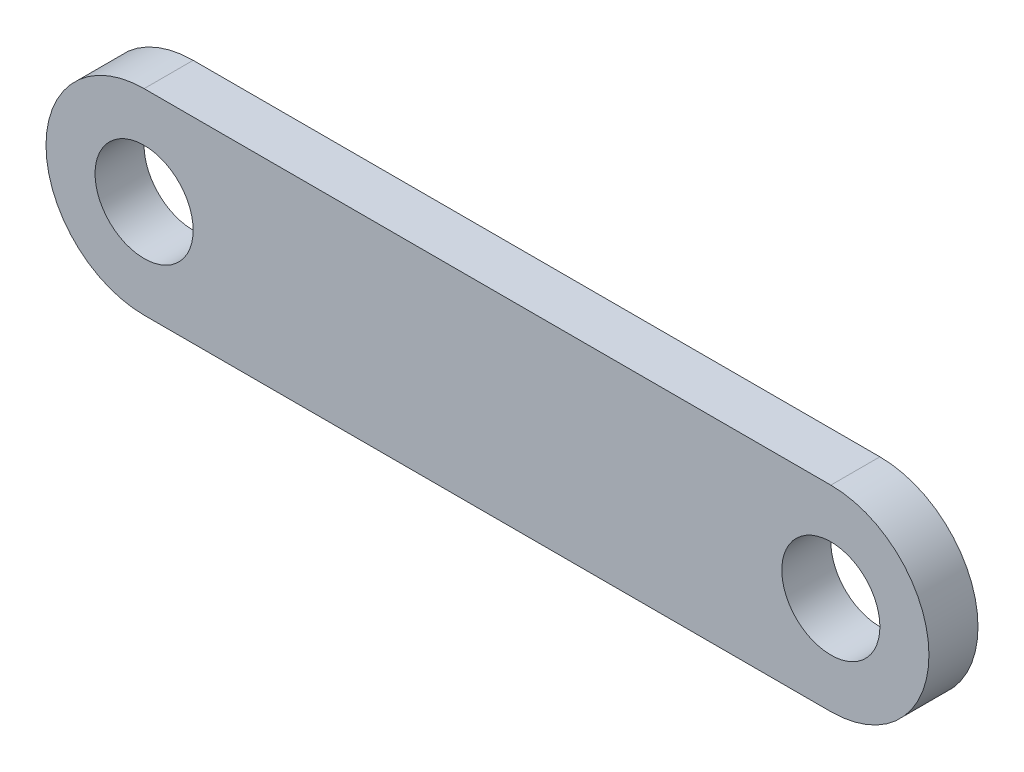
ISO-10303-21;
HEADER;
FILE_DESCRIPTION(('STEP AP214'),'2;1');
FILE_NAME('part.step','',(''),(''),'','','');
FILE_SCHEMA(('AUTOMOTIVE_DESIGN { 1 0 10303 214 1 1 1 1 }'));
ENDSEC;
DATA;
#1=APPLICATION_CONTEXT('core data for automotive mechanical design processes');
#2=APPLICATION_PROTOCOL_DEFINITION('international standard','automotive_design',2000,#1);
#3=PRODUCT_CONTEXT('',#1,'mechanical');
#4=PRODUCT('Part','Part','',(#3));
#5=PRODUCT_RELATED_PRODUCT_CATEGORY('part','',(#4));
#6=PRODUCT_DEFINITION_FORMATION('','',#4);
#7=PRODUCT_DEFINITION_CONTEXT('part definition',#1,'design');
#8=PRODUCT_DEFINITION('design','',#6,#7);
#9=PRODUCT_DEFINITION_SHAPE('','',#8);
#10=(LENGTH_UNIT() NAMED_UNIT(*) SI_UNIT(.MILLI.,.METRE.));
#11=(NAMED_UNIT(*) PLANE_ANGLE_UNIT() SI_UNIT($,.RADIAN.));
#12=(NAMED_UNIT(*) SI_UNIT($,.STERADIAN.) SOLID_ANGLE_UNIT());
#13=UNCERTAINTY_MEASURE_WITH_UNIT(LENGTH_MEASURE(1.E-05),#10,'distance_accuracy_value','');
#14=(GEOMETRIC_REPRESENTATION_CONTEXT(3) GLOBAL_UNCERTAINTY_ASSIGNED_CONTEXT((#13)) GLOBAL_UNIT_ASSIGNED_CONTEXT((#10,
#11,#12)) REPRESENTATION_CONTEXT('',''));
#15=CARTESIAN_POINT('',(0.,0.,0.));
#16=DIRECTION('',(0.,0.,1.));
#17=DIRECTION('',(1.,0.,0.));
#18=AXIS2_PLACEMENT_3D('',#15,#16,#17);
#19=CARTESIAN_POINT('',(-54.9334503771296,17.5548200118219,5.));
#20=DIRECTION('',(0.,0.,1.));
#21=DIRECTION('',(1.,0.,0.));
#22=AXIS2_PLACEMENT_3D('',#19,#20,#21);
#23=PLANE('',#22);
#24=CARTESIAN_POINT('',(-54.9334503771296,17.5548200118219,5.));
#25=DIRECTION('',(0.,0.,1.));
#26=DIRECTION('',(1.,0.,0.));
#27=AXIS2_PLACEMENT_3D('',#24,#25,#26);
#28=CIRCLE('',#27,5.);
#29=CARTESIAN_POINT('',(-49.9334503771297,17.5548200118219,5.));
#30=VERTEX_POINT('',#29);
#31=EDGE_CURVE('E112',#30,#30,#28,.T.);
#32=ORIENTED_EDGE('',*,*,#31,.F.);
#33=EDGE_LOOP('',(#32));
#34=FACE_BOUND('',#33,.T.);
#35=CARTESIAN_POINT('',(-54.9334503771296,17.5548200118219,5.));
#36=DIRECTION('',(0.,0.,1.));
#37=DIRECTION('',(1.,0.,0.));
#38=AXIS2_PLACEMENT_3D('',#35,#36,#37);
#39=CIRCLE('',#38,10.);
#40=CARTESIAN_POINT('',(-54.9334503771296,27.5548200118219,5.));
#41=VERTEX_POINT('',#40);
#42=CARTESIAN_POINT('',(-54.9334503771296,7.55482001182186,5.));
#43=VERTEX_POINT('',#42);
#44=EDGE_CURVE('E92',#41,#43,#39,.T.);
#45=ORIENTED_EDGE('',*,*,#44,.T.);
#46=DIRECTION('',(1.,0.,0.));
#47=VECTOR('',#46,1.);
#48=CARTESIAN_POINT('',(-54.9334503771296,7.55482001182186,5.));
#49=LINE('',#48,#47);
#50=CARTESIAN_POINT('',(15.0665496228704,7.55482001182186,5.));
#51=VERTEX_POINT('',#50);
#52=EDGE_CURVE('E87',#43,#51,#49,.T.);
#53=ORIENTED_EDGE('',*,*,#52,.T.);
#54=CARTESIAN_POINT('',(15.0665496228704,17.5548200118219,5.));
#55=DIRECTION('',(0.,0.,1.));
#56=DIRECTION('',(1.,0.,0.));
#57=AXIS2_PLACEMENT_3D('',#54,#55,#56);
#58=CIRCLE('',#57,10.);
#59=CARTESIAN_POINT('',(15.0665496228704,27.5548200118219,5.));
#60=VERTEX_POINT('',#59);
#61=EDGE_CURVE('E90',#51,#60,#58,.T.);
#62=ORIENTED_EDGE('',*,*,#61,.T.);
#63=DIRECTION('',(-1.,0.,0.));
#64=VECTOR('',#63,1.);
#65=CARTESIAN_POINT('',(-54.9334503771296,27.5548200118219,5.));
#66=LINE('',#65,#64);
#67=EDGE_CURVE('E57',#60,#41,#66,.T.);
#68=ORIENTED_EDGE('',*,*,#67,.T.);
#69=EDGE_LOOP('',(#45,#53,#62,#68));
#70=FACE_BOUND('',#69,.T.);
#71=CARTESIAN_POINT('',(15.0665496228704,17.5548200118219,5.));
#72=DIRECTION('',(0.,0.,1.));
#73=DIRECTION('',(1.,0.,0.));
#74=AXIS2_PLACEMENT_3D('',#71,#72,#73);
#75=CIRCLE('',#74,5.);
#76=CARTESIAN_POINT('',(20.0665496228704,17.5548200118219,5.));
#77=VERTEX_POINT('',#76);
#78=EDGE_CURVE('E134',#77,#77,#75,.T.);
#79=ORIENTED_EDGE('',*,*,#78,.F.);
#80=EDGE_LOOP('',(#79));
#81=FACE_BOUND('',#80,.T.);
#82=ADVANCED_FACE('F39',(#34,#70,#81),#23,.T.);
#83=CARTESIAN_POINT('',(-54.9334503771296,17.5548200118219,0.));
#84=DIRECTION('',(0.,0.,1.));
#85=DIRECTION('',(1.,0.,0.));
#86=AXIS2_PLACEMENT_3D('',#83,#84,#85);
#87=PLANE('',#86);
#88=CARTESIAN_POINT('',(-54.9334503771296,17.5548200118219,0.));
#89=DIRECTION('',(0.,0.,1.));
#90=DIRECTION('',(1.,0.,0.));
#91=AXIS2_PLACEMENT_3D('',#88,#89,#90);
#92=CIRCLE('',#91,10.);
#93=CARTESIAN_POINT('',(-54.9334503771296,27.5548200118219,0.));
#94=VERTEX_POINT('',#93);
#95=CARTESIAN_POINT('',(-54.9334503771296,7.55482001182186,0.));
#96=VERTEX_POINT('',#95);
#97=EDGE_CURVE('E108',#94,#96,#92,.T.);
#98=ORIENTED_EDGE('',*,*,#97,.F.);
#99=DIRECTION('',(-1.,0.,0.));
#100=VECTOR('',#99,1.);
#101=CARTESIAN_POINT('',(-54.9334503771296,27.5548200118219,0.));
#102=LINE('',#101,#100);
#103=CARTESIAN_POINT('',(15.0665496228704,27.5548200118219,0.));
#104=VERTEX_POINT('',#103);
#105=EDGE_CURVE('E80',#104,#94,#102,.T.);
#106=ORIENTED_EDGE('',*,*,#105,.F.);
#107=CARTESIAN_POINT('',(15.0665496228704,17.5548200118219,0.));
#108=DIRECTION('',(0.,0.,1.));
#109=DIRECTION('',(1.,0.,0.));
#110=AXIS2_PLACEMENT_3D('',#107,#108,#109);
#111=CIRCLE('',#110,10.);
#112=CARTESIAN_POINT('',(15.0665496228704,7.55482001182186,0.));
#113=VERTEX_POINT('',#112);
#114=EDGE_CURVE('E74',#113,#104,#111,.T.);
#115=ORIENTED_EDGE('',*,*,#114,.F.);
#116=DIRECTION('',(1.,0.,0.));
#117=VECTOR('',#116,1.);
#118=CARTESIAN_POINT('',(-54.9334503771296,7.55482001182186,0.));
#119=LINE('',#118,#117);
#120=EDGE_CURVE('E97',#96,#113,#119,.T.);
#121=ORIENTED_EDGE('',*,*,#120,.F.);
#122=EDGE_LOOP('',(#98,#106,#115,#121));
#123=FACE_BOUND('',#122,.T.);
#124=CARTESIAN_POINT('',(-54.9334503771296,17.5548200118219,0.));
#125=DIRECTION('',(0.,0.,1.));
#126=DIRECTION('',(1.,0.,0.));
#127=AXIS2_PLACEMENT_3D('',#124,#125,#126);
#128=CIRCLE('',#127,5.);
#129=CARTESIAN_POINT('',(-49.9334503771297,17.5548200118219,0.));
#130=VERTEX_POINT('',#129);
#131=EDGE_CURVE('E130',#130,#130,#128,.T.);
#132=ORIENTED_EDGE('',*,*,#131,.T.);
#133=EDGE_LOOP('',(#132));
#134=FACE_BOUND('',#133,.T.);
#135=CARTESIAN_POINT('',(15.0665496228704,17.5548200118219,0.));
#136=DIRECTION('',(0.,0.,1.));
#137=DIRECTION('',(1.,0.,0.));
#138=AXIS2_PLACEMENT_3D('',#135,#136,#137);
#139=CIRCLE('',#138,5.);
#140=CARTESIAN_POINT('',(20.0665496228704,17.5548200118219,0.));
#141=VERTEX_POINT('',#140);
#142=EDGE_CURVE('E138',#141,#141,#139,.T.);
#143=ORIENTED_EDGE('',*,*,#142,.T.);
#144=EDGE_LOOP('',(#143));
#145=FACE_BOUND('',#144,.T.);
#146=ADVANCED_FACE('F125',(#123,#134,#145),#87,.F.);
#147=CARTESIAN_POINT('',(-54.9334503771296,17.5548200118219,5.));
#148=DIRECTION('',(0.,0.,-1.));
#149=DIRECTION('',(-1.,0.,0.));
#150=AXIS2_PLACEMENT_3D('',#147,#148,#149);
#151=CYLINDRICAL_SURFACE('',#150,10.);
#152=ORIENTED_EDGE('',*,*,#97,.T.);
#153=DIRECTION('',(0.,0.,-1.));
#154=VECTOR('',#153,1.);
#155=CARTESIAN_POINT('',(-54.9334503771296,7.55482001182186,5.));
#156=LINE('',#155,#154);
#157=EDGE_CURVE('E11',#43,#96,#156,.T.);
#158=ORIENTED_EDGE('',*,*,#157,.F.);
#159=ORIENTED_EDGE('',*,*,#44,.F.);
#160=DIRECTION('',(0.,0.,-1.));
#161=VECTOR('',#160,1.);
#162=CARTESIAN_POINT('',(-54.9334503771296,27.5548200118219,5.));
#163=LINE('',#162,#161);
#164=EDGE_CURVE('E104',#41,#94,#163,.T.);
#165=ORIENTED_EDGE('',*,*,#164,.T.);
#166=EDGE_LOOP('',(#152,#158,#159,#165));
#167=FACE_BOUND('',#166,.T.);
#168=ADVANCED_FACE('F41',(#167),#151,.T.);
#169=CARTESIAN_POINT('',(-54.9334503771296,7.55482001182186,5.));
#170=DIRECTION('',(0.,1.,0.));
#171=DIRECTION('',(0.,0.,1.));
#172=AXIS2_PLACEMENT_3D('',#169,#170,#171);
#173=PLANE('',#172);
#174=ORIENTED_EDGE('',*,*,#120,.T.);
#175=DIRECTION('',(0.,0.,-1.));
#176=VECTOR('',#175,1.);
#177=CARTESIAN_POINT('',(15.0665496228704,7.55482001182186,5.));
#178=LINE('',#177,#176);
#179=EDGE_CURVE('E49',#51,#113,#178,.T.);
#180=ORIENTED_EDGE('',*,*,#179,.F.);
#181=ORIENTED_EDGE('',*,*,#52,.F.);
#182=ORIENTED_EDGE('',*,*,#157,.T.);
#183=EDGE_LOOP('',(#174,#180,#181,#182));
#184=FACE_BOUND('',#183,.T.);
#185=ADVANCED_FACE('F96',(#184),#173,.F.);
#186=CARTESIAN_POINT('',(15.0665496228704,17.5548200118219,5.));
#187=DIRECTION('',(0.,0.,-1.));
#188=DIRECTION('',(-1.,0.,0.));
#189=AXIS2_PLACEMENT_3D('',#186,#187,#188);
#190=CYLINDRICAL_SURFACE('',#189,10.);
#191=ORIENTED_EDGE('',*,*,#114,.T.);
#192=DIRECTION('',(0.,0.,-1.));
#193=VECTOR('',#192,1.);
#194=CARTESIAN_POINT('',(15.0665496228704,27.5548200118219,5.));
#195=LINE('',#194,#193);
#196=EDGE_CURVE('E99',#60,#104,#195,.T.);
#197=ORIENTED_EDGE('',*,*,#196,.F.);
#198=ORIENTED_EDGE('',*,*,#61,.F.);
#199=ORIENTED_EDGE('',*,*,#179,.T.);
#200=EDGE_LOOP('',(#191,#197,#198,#199));
#201=FACE_BOUND('',#200,.T.);
#202=ADVANCED_FACE('F100',(#201),#190,.T.);
#203=CARTESIAN_POINT('',(-54.9334503771296,27.5548200118219,5.));
#204=DIRECTION('',(0.,-1.,0.));
#205=DIRECTION('',(1.,0.,0.));
#206=AXIS2_PLACEMENT_3D('',#203,#204,#205);
#207=PLANE('',#206);
#208=ORIENTED_EDGE('',*,*,#105,.T.);
#209=ORIENTED_EDGE('',*,*,#164,.F.);
#210=ORIENTED_EDGE('',*,*,#67,.F.);
#211=ORIENTED_EDGE('',*,*,#196,.T.);
#212=EDGE_LOOP('',(#208,#209,#210,#211));
#213=FACE_BOUND('',#212,.T.);
#214=ADVANCED_FACE('F122',(#213),#207,.F.);
#215=CARTESIAN_POINT('',(-54.9334503771296,17.5548200118219,5.));
#216=DIRECTION('',(0.,0.,-1.));
#217=DIRECTION('',(-1.,0.,0.));
#218=AXIS2_PLACEMENT_3D('',#215,#216,#217);
#219=CYLINDRICAL_SURFACE('',#218,5.);
#220=ORIENTED_EDGE('',*,*,#31,.T.);
#221=EDGE_LOOP('',(#220));
#222=FACE_BOUND('',#221,.T.);
#223=ORIENTED_EDGE('',*,*,#131,.F.);
#224=EDGE_LOOP('',(#223));
#225=FACE_BOUND('',#224,.T.);
#226=ADVANCED_FACE('F157',(#222,#225),#219,.F.);
#227=CARTESIAN_POINT('',(15.0665496228704,17.5548200118219,5.));
#228=DIRECTION('',(0.,0.,-1.));
#229=DIRECTION('',(-1.,0.,0.));
#230=AXIS2_PLACEMENT_3D('',#227,#228,#229);
#231=CYLINDRICAL_SURFACE('',#230,5.);
#232=ORIENTED_EDGE('',*,*,#78,.T.);
#233=EDGE_LOOP('',(#232));
#234=FACE_BOUND('',#233,.T.);
#235=ORIENTED_EDGE('',*,*,#142,.F.);
#236=EDGE_LOOP('',(#235));
#237=FACE_BOUND('',#236,.T.);
#238=ADVANCED_FACE('F146',(#234,#237),#231,.F.);
#239=CLOSED_SHELL('',(#82,#146,#168,#185,#202,#214,#226,#238));
#240=MANIFOLD_SOLID_BREP('B2',#239);
#241=ADVANCED_BREP_SHAPE_REPRESENTATION('',(#18,#240),#14);
#242=SHAPE_DEFINITION_REPRESENTATION(#9,#241);
ENDSEC;
END-ISO-10303-21;
